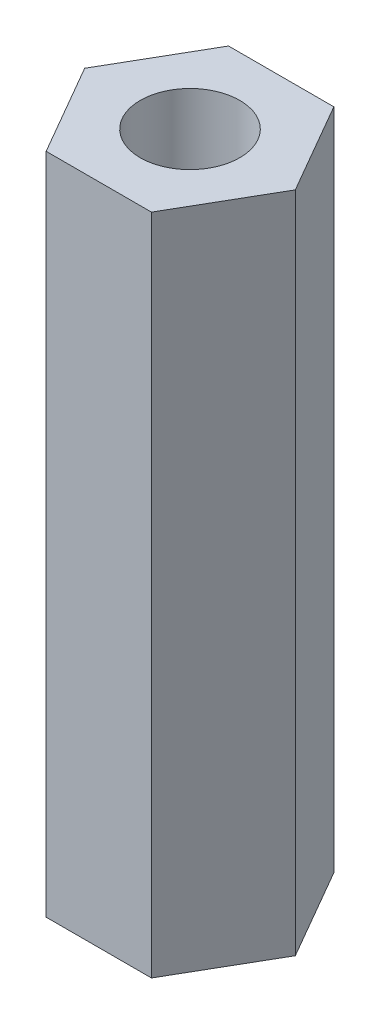
ISO-10303-21;
HEADER;
FILE_DESCRIPTION(('STEP AP214'),'2;1');
FILE_NAME('part.step','',(''),(''),'','','');
FILE_SCHEMA(('AUTOMOTIVE_DESIGN { 1 0 10303 214 1 1 1 1 }'));
ENDSEC;
DATA;
#1=APPLICATION_CONTEXT('core data for automotive mechanical design processes');
#2=APPLICATION_PROTOCOL_DEFINITION('international standard','automotive_design',2000,#1);
#3=PRODUCT_CONTEXT('',#1,'mechanical');
#4=PRODUCT('Part','Part','',(#3));
#5=PRODUCT_RELATED_PRODUCT_CATEGORY('part','',(#4));
#6=PRODUCT_DEFINITION_FORMATION('','',#4);
#7=PRODUCT_DEFINITION_CONTEXT('part definition',#1,'design');
#8=PRODUCT_DEFINITION('design','',#6,#7);
#9=PRODUCT_DEFINITION_SHAPE('','',#8);
#10=(LENGTH_UNIT() NAMED_UNIT(*) SI_UNIT(.MILLI.,.METRE.));
#11=(NAMED_UNIT(*) PLANE_ANGLE_UNIT() SI_UNIT($,.RADIAN.));
#12=(NAMED_UNIT(*) SI_UNIT($,.STERADIAN.) SOLID_ANGLE_UNIT());
#13=UNCERTAINTY_MEASURE_WITH_UNIT(LENGTH_MEASURE(1.E-05),#10,'distance_accuracy_value','');
#14=(GEOMETRIC_REPRESENTATION_CONTEXT(3) GLOBAL_UNCERTAINTY_ASSIGNED_CONTEXT((#13)) GLOBAL_UNIT_ASSIGNED_CONTEXT((#10,
#11,#12)) REPRESENTATION_CONTEXT('',''));
#15=CARTESIAN_POINT('',(0.,0.,0.));
#16=DIRECTION('',(0.,0.,1.));
#17=DIRECTION('',(1.,0.,0.));
#18=AXIS2_PLACEMENT_3D('',#15,#16,#17);
#19=CARTESIAN_POINT('',(1.5877132402715,20.,2.74999999999997));
#20=DIRECTION('',(-0.866025403784442,0.,-0.499999999999995));
#21=DIRECTION('',(-0.499999999999995,0.,0.866025403784442));
#22=AXIS2_PLACEMENT_3D('',#19,#20,#21);
#23=PLANE('',#22);
#24=DIRECTION('',(0.499999999999995,0.,-0.866025403784441));
#25=VECTOR('',#24,1.);
#26=CARTESIAN_POINT('',(1.5877132402715,0.,2.74999999999997));
#27=LINE('',#26,#25);
#28=CARTESIAN_POINT('',(1.5877132402715,0.,2.74999999999997));
#29=VERTEX_POINT('',#28);
#30=CARTESIAN_POINT('',(3.17542648054293,0.,0.));
#31=VERTEX_POINT('',#30);
#32=EDGE_CURVE('E121',#29,#31,#27,.T.);
#33=ORIENTED_EDGE('',*,*,#32,.T.);
#34=DIRECTION('',(0.,-1.,0.));
#35=VECTOR('',#34,1.);
#36=CARTESIAN_POINT('',(3.17542648054293,20.,0.));
#37=LINE('',#36,#35);
#38=CARTESIAN_POINT('',(3.17542648054293,20.,0.));
#39=VERTEX_POINT('',#38);
#40=EDGE_CURVE('E11',#39,#31,#37,.T.);
#41=ORIENTED_EDGE('',*,*,#40,.F.);
#42=DIRECTION('',(0.499999999999995,0.,-0.866025403784441));
#43=VECTOR('',#42,1.);
#44=CARTESIAN_POINT('',(1.5877132402715,20.,2.74999999999997));
#45=LINE('',#44,#43);
#46=CARTESIAN_POINT('',(1.5877132402715,20.,2.74999999999997));
#47=VERTEX_POINT('',#46);
#48=EDGE_CURVE('E132',#47,#39,#45,.T.);
#49=ORIENTED_EDGE('',*,*,#48,.F.);
#50=DIRECTION('',(0.,-1.,0.));
#51=VECTOR('',#50,1.);
#52=CARTESIAN_POINT('',(1.5877132402715,20.,2.74999999999997));
#53=LINE('',#52,#51);
#54=EDGE_CURVE('E117',#47,#29,#53,.T.);
#55=ORIENTED_EDGE('',*,*,#54,.T.);
#56=EDGE_LOOP('',(#33,#41,#49,#55));
#57=FACE_BOUND('',#56,.T.);
#58=ADVANCED_FACE('F37',(#57),#23,.F.);
#59=CARTESIAN_POINT('',(3.17542648054293,20.,0.));
#60=DIRECTION('',(-0.866025403784438,0.,0.500000000000001));
#61=DIRECTION('',(0.500000000000001,0.,0.866025403784438));
#62=AXIS2_PLACEMENT_3D('',#59,#60,#61);
#63=PLANE('',#62);
#64=DIRECTION('',(-0.500000000000001,0.,-0.866025403784438));
#65=VECTOR('',#64,1.);
#66=CARTESIAN_POINT('',(3.17542648054293,0.,0.));
#67=LINE('',#66,#65);
#68=CARTESIAN_POINT('',(1.58771324027146,0.,-2.74999999999999));
#69=VERTEX_POINT('',#68);
#70=EDGE_CURVE('E124',#31,#69,#67,.T.);
#71=ORIENTED_EDGE('',*,*,#70,.T.);
#72=DIRECTION('',(0.,-1.,0.));
#73=VECTOR('',#72,1.);
#74=CARTESIAN_POINT('',(1.58771324027146,20.,-2.74999999999999));
#75=LINE('',#74,#73);
#76=CARTESIAN_POINT('',(1.58771324027146,20.,-2.74999999999999));
#77=VERTEX_POINT('',#76);
#78=EDGE_CURVE('E45',#77,#69,#75,.T.);
#79=ORIENTED_EDGE('',*,*,#78,.F.);
#80=DIRECTION('',(-0.500000000000001,0.,-0.866025403784438));
#81=VECTOR('',#80,1.);
#82=CARTESIAN_POINT('',(3.17542648054293,20.,0.));
#83=LINE('',#82,#81);
#84=EDGE_CURVE('E90',#39,#77,#83,.T.);
#85=ORIENTED_EDGE('',*,*,#84,.F.);
#86=ORIENTED_EDGE('',*,*,#40,.T.);
#87=EDGE_LOOP('',(#71,#79,#85,#86));
#88=FACE_BOUND('',#87,.T.);
#89=ADVANCED_FACE('F157',(#88),#63,.F.);
#90=CARTESIAN_POINT('',(1.58771324027146,20.,-2.74999999999999));
#91=DIRECTION('',(0.,0.,1.));
#92=DIRECTION('',(1.,0.,0.));
#93=AXIS2_PLACEMENT_3D('',#90,#91,#92);
#94=PLANE('',#93);
#95=DIRECTION('',(-1.,0.,0.));
#96=VECTOR('',#95,1.);
#97=CARTESIAN_POINT('',(1.58771324027146,0.,-2.74999999999999));
#98=LINE('',#97,#96);
#99=CARTESIAN_POINT('',(-1.58771324027148,0.,-2.74999999999998));
#100=VERTEX_POINT('',#99);
#101=EDGE_CURVE('E127',#69,#100,#98,.T.);
#102=ORIENTED_EDGE('',*,*,#101,.T.);
#103=DIRECTION('',(0.,-1.,0.));
#104=VECTOR('',#103,1.);
#105=CARTESIAN_POINT('',(-1.58771324027148,20.,-2.74999999999998));
#106=LINE('',#105,#104);
#107=CARTESIAN_POINT('',(-1.58771324027148,20.,-2.74999999999998));
#108=VERTEX_POINT('',#107);
#109=EDGE_CURVE('E112',#108,#100,#106,.T.);
#110=ORIENTED_EDGE('',*,*,#109,.F.);
#111=DIRECTION('',(-1.,0.,0.));
#112=VECTOR('',#111,1.);
#113=CARTESIAN_POINT('',(1.58771324027146,20.,-2.74999999999999));
#114=LINE('',#113,#112);
#115=EDGE_CURVE('E103',#77,#108,#114,.T.);
#116=ORIENTED_EDGE('',*,*,#115,.F.);
#117=ORIENTED_EDGE('',*,*,#78,.T.);
#118=EDGE_LOOP('',(#102,#110,#116,#117));
#119=FACE_BOUND('',#118,.T.);
#120=ADVANCED_FACE('F138',(#119),#94,.F.);
#121=CARTESIAN_POINT('',(-1.58771324027148,20.,-2.74999999999998));
#122=DIRECTION('',(0.866025403784442,0.,0.499999999999995));
#123=DIRECTION('',(0.499999999999995,0.,-0.866025403784442));
#124=AXIS2_PLACEMENT_3D('',#121,#122,#123);
#125=PLANE('',#124);
#126=DIRECTION('',(-0.499999999999995,0.,0.866025403784442));
#127=VECTOR('',#126,1.);
#128=CARTESIAN_POINT('',(-1.58771324027148,0.,-2.74999999999998));
#129=LINE('',#128,#127);
#130=CARTESIAN_POINT('',(-3.17542648054293,0.,0.));
#131=VERTEX_POINT('',#130);
#132=EDGE_CURVE('E111',#100,#131,#129,.T.);
#133=ORIENTED_EDGE('',*,*,#132,.T.);
#134=DIRECTION('',(0.,-1.,0.));
#135=VECTOR('',#134,1.);
#136=CARTESIAN_POINT('',(-3.17542648054293,20.,0.));
#137=LINE('',#136,#135);
#138=CARTESIAN_POINT('',(-3.17542648054293,20.,0.));
#139=VERTEX_POINT('',#138);
#140=EDGE_CURVE('E108',#139,#131,#137,.T.);
#141=ORIENTED_EDGE('',*,*,#140,.F.);
#142=DIRECTION('',(-0.499999999999995,0.,0.866025403784442));
#143=VECTOR('',#142,1.);
#144=CARTESIAN_POINT('',(-1.58771324027148,20.,-2.74999999999998));
#145=LINE('',#144,#143);
#146=EDGE_CURVE('E97',#108,#139,#145,.T.);
#147=ORIENTED_EDGE('',*,*,#146,.F.);
#148=ORIENTED_EDGE('',*,*,#109,.T.);
#149=EDGE_LOOP('',(#133,#141,#147,#148));
#150=FACE_BOUND('',#149,.T.);
#151=ADVANCED_FACE('F109',(#150),#125,.F.);
#152=CARTESIAN_POINT('',(-3.17542648054293,20.,0.));
#153=DIRECTION('',(0.866025403784435,0.,-0.500000000000007));
#154=DIRECTION('',(-0.500000000000007,0.,-0.866025403784435));
#155=AXIS2_PLACEMENT_3D('',#152,#153,#154);
#156=PLANE('',#155);
#157=DIRECTION('',(0.500000000000007,0.,0.866025403784435));
#158=VECTOR('',#157,1.);
#159=CARTESIAN_POINT('',(-3.17542648054293,0.,0.));
#160=LINE('',#159,#158);
#161=CARTESIAN_POINT('',(-1.58771324027144,0.,2.75));
#162=VERTEX_POINT('',#161);
#163=EDGE_CURVE('E76',#131,#162,#160,.T.);
#164=ORIENTED_EDGE('',*,*,#163,.T.);
#165=DIRECTION('',(0.,-1.,0.));
#166=VECTOR('',#165,1.);
#167=CARTESIAN_POINT('',(-1.58771324027144,20.,2.75));
#168=LINE('',#167,#166);
#169=CARTESIAN_POINT('',(-1.58771324027144,20.,2.75));
#170=VERTEX_POINT('',#169);
#171=EDGE_CURVE('E113',#170,#162,#168,.T.);
#172=ORIENTED_EDGE('',*,*,#171,.F.);
#173=DIRECTION('',(0.500000000000007,0.,0.866025403784435));
#174=VECTOR('',#173,1.);
#175=CARTESIAN_POINT('',(-3.17542648054293,20.,0.));
#176=LINE('',#175,#174);
#177=EDGE_CURVE('E101',#139,#170,#176,.T.);
#178=ORIENTED_EDGE('',*,*,#177,.F.);
#179=ORIENTED_EDGE('',*,*,#140,.T.);
#180=EDGE_LOOP('',(#164,#172,#178,#179));
#181=FACE_BOUND('',#180,.T.);
#182=ADVANCED_FACE('F115',(#181),#156,.F.);
#183=CARTESIAN_POINT('',(-1.58771324027144,20.,2.75));
#184=DIRECTION('',(0.,0.,-1.));
#185=DIRECTION('',(-1.,0.,0.));
#186=AXIS2_PLACEMENT_3D('',#183,#184,#185);
#187=PLANE('',#186);
#188=DIRECTION('',(1.,0.,0.));
#189=VECTOR('',#188,1.);
#190=CARTESIAN_POINT('',(-1.58771324027144,0.,2.75));
#191=LINE('',#190,#189);
#192=EDGE_CURVE('E82',#162,#29,#191,.T.);
#193=ORIENTED_EDGE('',*,*,#192,.T.);
#194=ORIENTED_EDGE('',*,*,#54,.F.);
#195=DIRECTION('',(1.,0.,0.));
#196=VECTOR('',#195,1.);
#197=CARTESIAN_POINT('',(-1.58771324027144,20.,2.75));
#198=LINE('',#197,#196);
#199=EDGE_CURVE('E53',#170,#47,#198,.T.);
#200=ORIENTED_EDGE('',*,*,#199,.F.);
#201=ORIENTED_EDGE('',*,*,#171,.T.);
#202=EDGE_LOOP('',(#193,#194,#200,#201));
#203=FACE_BOUND('',#202,.T.);
#204=ADVANCED_FACE('F145',(#203),#187,.F.);
#205=CARTESIAN_POINT('',(0.,20.,0.));
#206=DIRECTION('',(0.,1.,0.));
#207=DIRECTION('',(0.,0.,1.));
#208=AXIS2_PLACEMENT_3D('',#205,#206,#207);
#209=PLANE('',#208);
#210=CARTESIAN_POINT('',(0.,20.,0.));
#211=DIRECTION('',(0.,1.,0.));
#212=DIRECTION('',(0.,0.,1.));
#213=AXIS2_PLACEMENT_3D('',#210,#211,#212);
#214=CIRCLE('',#213,1.5);
#215=CARTESIAN_POINT('',(0.,20.,1.5));
#216=VERTEX_POINT('',#215);
#217=EDGE_CURVE('E125',#216,#216,#214,.T.);
#218=ORIENTED_EDGE('',*,*,#217,.F.);
#219=EDGE_LOOP('',(#218));
#220=FACE_BOUND('',#219,.T.);
#221=ORIENTED_EDGE('',*,*,#48,.T.);
#222=ORIENTED_EDGE('',*,*,#84,.T.);
#223=ORIENTED_EDGE('',*,*,#115,.T.);
#224=ORIENTED_EDGE('',*,*,#146,.T.);
#225=ORIENTED_EDGE('',*,*,#177,.T.);
#226=ORIENTED_EDGE('',*,*,#199,.T.);
#227=EDGE_LOOP('',(#221,#222,#223,#224,#225,#226));
#228=FACE_BOUND('',#227,.T.);
#229=ADVANCED_FACE('F99',(#220,#228),#209,.T.);
#230=CARTESIAN_POINT('',(0.,0.,0.));
#231=DIRECTION('',(0.,1.,0.));
#232=DIRECTION('',(0.,0.,1.));
#233=AXIS2_PLACEMENT_3D('',#230,#231,#232);
#234=PLANE('',#233);
#235=CARTESIAN_POINT('',(0.,0.,0.));
#236=DIRECTION('',(0.,1.,0.));
#237=DIRECTION('',(0.,0.,1.));
#238=AXIS2_PLACEMENT_3D('',#235,#236,#237);
#239=CIRCLE('',#238,1.5);
#240=CARTESIAN_POINT('',(0.,0.,1.5));
#241=VERTEX_POINT('',#240);
#242=EDGE_CURVE('E215',#241,#241,#239,.T.);
#243=ORIENTED_EDGE('',*,*,#242,.T.);
#244=EDGE_LOOP('',(#243));
#245=FACE_BOUND('',#244,.T.);
#246=ORIENTED_EDGE('',*,*,#32,.F.);
#247=ORIENTED_EDGE('',*,*,#192,.F.);
#248=ORIENTED_EDGE('',*,*,#163,.F.);
#249=ORIENTED_EDGE('',*,*,#132,.F.);
#250=ORIENTED_EDGE('',*,*,#101,.F.);
#251=ORIENTED_EDGE('',*,*,#70,.F.);
#252=EDGE_LOOP('',(#246,#247,#248,#249,#250,#251));
#253=FACE_BOUND('',#252,.T.);
#254=ADVANCED_FACE('F141',(#245,#253),#234,.F.);
#255=CARTESIAN_POINT('',(0.,10.,0.));
#256=DIRECTION('',(0.,1.,0.));
#257=DIRECTION('',(0.,0.,1.));
#258=AXIS2_PLACEMENT_3D('',#255,#256,#257);
#259=CYLINDRICAL_SURFACE('',#258,1.5);
#260=ORIENTED_EDGE('',*,*,#217,.T.);
#261=EDGE_LOOP('',(#260));
#262=FACE_BOUND('',#261,.T.);
#263=ORIENTED_EDGE('',*,*,#242,.F.);
#264=EDGE_LOOP('',(#263));
#265=FACE_BOUND('',#264,.T.);
#266=ADVANCED_FACE('F194',(#262,#265),#259,.F.);
#267=CLOSED_SHELL('',(#58,#89,#120,#151,#182,#204,#229,#254,#266));
#268=MANIFOLD_SOLID_BREP('B2',#267);
#269=ADVANCED_BREP_SHAPE_REPRESENTATION('',(#18,#268),#14);
#270=SHAPE_DEFINITION_REPRESENTATION(#9,#269);
ENDSEC;
END-ISO-10303-21;
